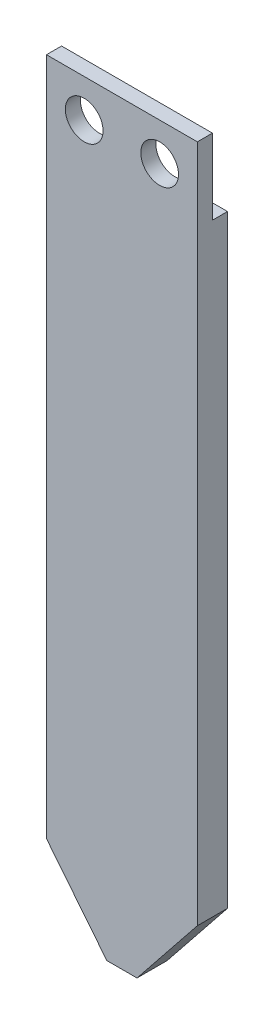
ISO-10303-21;
HEADER;
FILE_DESCRIPTION(('STEP AP214'),'2;1');
FILE_NAME('part.step','',(''),(''),'','','');
FILE_SCHEMA(('AUTOMOTIVE_DESIGN { 1 0 10303 214 1 1 1 1 }'));
ENDSEC;
DATA;
#1=APPLICATION_CONTEXT('core data for automotive mechanical design processes');
#2=APPLICATION_PROTOCOL_DEFINITION('international standard','automotive_design',2000,#1);
#3=PRODUCT_CONTEXT('',#1,'mechanical');
#4=PRODUCT('Part','Part','',(#3));
#5=PRODUCT_RELATED_PRODUCT_CATEGORY('part','',(#4));
#6=PRODUCT_DEFINITION_FORMATION('','',#4);
#7=PRODUCT_DEFINITION_CONTEXT('part definition',#1,'design');
#8=PRODUCT_DEFINITION('design','',#6,#7);
#9=PRODUCT_DEFINITION_SHAPE('','',#8);
#10=(LENGTH_UNIT() NAMED_UNIT(*) SI_UNIT(.MILLI.,.METRE.));
#11=(NAMED_UNIT(*) PLANE_ANGLE_UNIT() SI_UNIT($,.RADIAN.));
#12=(NAMED_UNIT(*) SI_UNIT($,.STERADIAN.) SOLID_ANGLE_UNIT());
#13=UNCERTAINTY_MEASURE_WITH_UNIT(LENGTH_MEASURE(1.E-05),#10,'distance_accuracy_value','');
#14=(GEOMETRIC_REPRESENTATION_CONTEXT(3) GLOBAL_UNCERTAINTY_ASSIGNED_CONTEXT((#13)) GLOBAL_UNIT_ASSIGNED_CONTEXT((#10,
#11,#12)) REPRESENTATION_CONTEXT('',''));
#15=CARTESIAN_POINT('',(0.,0.,0.));
#16=DIRECTION('',(0.,0.,1.));
#17=DIRECTION('',(1.,0.,0.));
#18=AXIS2_PLACEMENT_3D('',#15,#16,#17);
#19=CARTESIAN_POINT('',(0.,0.,4.));
#20=DIRECTION('',(1.,0.,0.));
#21=DIRECTION('',(0.,1.,0.));
#22=AXIS2_PLACEMENT_3D('',#19,#20,#21);
#23=PLANE('',#22);
#24=DIRECTION('',(0.,-1.,0.));
#25=VECTOR('',#24,1.);
#26=CARTESIAN_POINT('',(0.,0.,0.));
#27=LINE('',#26,#25);
#28=CARTESIAN_POINT('',(0.,-10.,0.));
#29=VERTEX_POINT('',#28);
#30=CARTESIAN_POINT('',(0.,-90.,0.));
#31=VERTEX_POINT('',#30);
#32=EDGE_CURVE('E124',#29,#31,#27,.T.);
#33=ORIENTED_EDGE('',*,*,#32,.T.);
#34=DIRECTION('',(0.,0.,1.));
#35=VECTOR('',#34,1.);
#36=CARTESIAN_POINT('',(0.,-90.,0.));
#37=LINE('',#36,#35);
#38=CARTESIAN_POINT('',(0.,-90.,4.));
#39=VERTEX_POINT('',#38);
#40=EDGE_CURVE('E61',#31,#39,#37,.T.);
#41=ORIENTED_EDGE('',*,*,#40,.T.);
#42=DIRECTION('',(0.,-1.,0.));
#43=VECTOR('',#42,1.);
#44=CARTESIAN_POINT('',(0.,0.,4.));
#45=LINE('',#44,#43);
#46=CARTESIAN_POINT('',(0.,0.,4.));
#47=VERTEX_POINT('',#46);
#48=EDGE_CURVE('E126',#47,#39,#45,.T.);
#49=ORIENTED_EDGE('',*,*,#48,.F.);
#50=DIRECTION('',(0.,0.,-1.));
#51=VECTOR('',#50,1.);
#52=CARTESIAN_POINT('',(0.,0.,4.));
#53=LINE('',#52,#51);
#54=CARTESIAN_POINT('',(0.,0.,2.));
#55=VERTEX_POINT('',#54);
#56=EDGE_CURVE('E46',#47,#55,#53,.T.);
#57=ORIENTED_EDGE('',*,*,#56,.T.);
#58=DIRECTION('',(0.,1.,0.));
#59=VECTOR('',#58,1.);
#60=CARTESIAN_POINT('',(0.,0.,2.));
#61=LINE('',#60,#59);
#62=CARTESIAN_POINT('',(0.,-10.,2.));
#63=VERTEX_POINT('',#62);
#64=EDGE_CURVE('E162',#63,#55,#61,.T.);
#65=ORIENTED_EDGE('',*,*,#64,.F.);
#66=DIRECTION('',(0.,0.,-1.));
#67=VECTOR('',#66,1.);
#68=CARTESIAN_POINT('',(0.,-10.,2.));
#69=LINE('',#68,#67);
#70=EDGE_CURVE('E157',#63,#29,#69,.T.);
#71=ORIENTED_EDGE('',*,*,#70,.T.);
#72=EDGE_LOOP('',(#33,#41,#49,#57,#65,#71));
#73=FACE_BOUND('',#72,.T.);
#74=ADVANCED_FACE('F38',(#73),#23,.F.);
#75=CARTESIAN_POINT('',(0.,-100.,4.));
#76=DIRECTION('',(0.,1.,0.));
#77=DIRECTION('',(0.,0.,1.));
#78=AXIS2_PLACEMENT_3D('',#75,#76,#77);
#79=PLANE('',#78);
#80=DIRECTION('',(1.,0.,0.));
#81=VECTOR('',#80,1.);
#82=CARTESIAN_POINT('',(0.,-100.,4.));
#83=LINE('',#82,#81);
#84=CARTESIAN_POINT('',(8.00000000000001,-100.,4.));
#85=VERTEX_POINT('',#84);
#86=CARTESIAN_POINT('',(12.,-100.,4.));
#87=VERTEX_POINT('',#86);
#88=EDGE_CURVE('E117',#85,#87,#83,.T.);
#89=ORIENTED_EDGE('',*,*,#88,.F.);
#90=DIRECTION('',(0.,0.,1.));
#91=VECTOR('',#90,1.);
#92=CARTESIAN_POINT('',(8.00000000000001,-100.,0.));
#93=LINE('',#92,#91);
#94=CARTESIAN_POINT('',(8.00000000000001,-100.,0.));
#95=VERTEX_POINT('',#94);
#96=EDGE_CURVE('E103',#95,#85,#93,.T.);
#97=ORIENTED_EDGE('',*,*,#96,.F.);
#98=DIRECTION('',(1.,0.,0.));
#99=VECTOR('',#98,1.);
#100=CARTESIAN_POINT('',(0.,-100.,0.));
#101=LINE('',#100,#99);
#102=CARTESIAN_POINT('',(12.,-100.,0.));
#103=VERTEX_POINT('',#102);
#104=EDGE_CURVE('E115',#95,#103,#101,.T.);
#105=ORIENTED_EDGE('',*,*,#104,.T.);
#106=DIRECTION('',(0.,0.,1.));
#107=VECTOR('',#106,1.);
#108=CARTESIAN_POINT('',(12.,-100.,0.));
#109=LINE('',#108,#107);
#110=EDGE_CURVE('E53',#103,#87,#109,.T.);
#111=ORIENTED_EDGE('',*,*,#110,.T.);
#112=EDGE_LOOP('',(#89,#97,#105,#111));
#113=FACE_BOUND('',#112,.T.);
#114=ADVANCED_FACE('F114',(#113),#79,.F.);
#115=CARTESIAN_POINT('',(20.,0.,4.));
#116=DIRECTION('',(-1.,0.,0.));
#117=DIRECTION('',(0.,-1.,0.));
#118=AXIS2_PLACEMENT_3D('',#115,#116,#117);
#119=PLANE('',#118);
#120=DIRECTION('',(0.,1.,0.));
#121=VECTOR('',#120,1.);
#122=CARTESIAN_POINT('',(20.,0.,4.));
#123=LINE('',#122,#121);
#124=CARTESIAN_POINT('',(20.,-90.,4.));
#125=VERTEX_POINT('',#124);
#126=CARTESIAN_POINT('',(20.,0.,4.));
#127=VERTEX_POINT('',#126);
#128=EDGE_CURVE('E138',#125,#127,#123,.T.);
#129=ORIENTED_EDGE('',*,*,#128,.F.);
#130=DIRECTION('',(0.,0.,1.));
#131=VECTOR('',#130,1.);
#132=CARTESIAN_POINT('',(20.,-90.,0.));
#133=LINE('',#132,#131);
#134=CARTESIAN_POINT('',(20.,-90.,0.));
#135=VERTEX_POINT('',#134);
#136=EDGE_CURVE('E170',#135,#125,#133,.T.);
#137=ORIENTED_EDGE('',*,*,#136,.F.);
#138=DIRECTION('',(0.,1.,0.));
#139=VECTOR('',#138,1.);
#140=CARTESIAN_POINT('',(20.,0.,0.));
#141=LINE('',#140,#139);
#142=CARTESIAN_POINT('',(20.,-9.99999999999999,0.));
#143=VERTEX_POINT('',#142);
#144=EDGE_CURVE('E123',#135,#143,#141,.T.);
#145=ORIENTED_EDGE('',*,*,#144,.T.);
#146=DIRECTION('',(0.,0.,-1.));
#147=VECTOR('',#146,1.);
#148=CARTESIAN_POINT('',(20.,-9.99999999999999,2.));
#149=LINE('',#148,#147);
#150=CARTESIAN_POINT('',(20.,-9.99999999999999,2.));
#151=VERTEX_POINT('',#150);
#152=EDGE_CURVE('E154',#151,#143,#149,.T.);
#153=ORIENTED_EDGE('',*,*,#152,.F.);
#154=DIRECTION('',(0.,-1.,0.));
#155=VECTOR('',#154,1.);
#156=CARTESIAN_POINT('',(20.,0.,2.));
#157=LINE('',#156,#155);
#158=CARTESIAN_POINT('',(20.,0.,2.));
#159=VERTEX_POINT('',#158);
#160=EDGE_CURVE('E165',#159,#151,#157,.T.);
#161=ORIENTED_EDGE('',*,*,#160,.F.);
#162=DIRECTION('',(0.,0.,-1.));
#163=VECTOR('',#162,1.);
#164=CARTESIAN_POINT('',(20.,0.,4.));
#165=LINE('',#164,#163);
#166=EDGE_CURVE('E11',#127,#159,#165,.T.);
#167=ORIENTED_EDGE('',*,*,#166,.F.);
#168=EDGE_LOOP('',(#129,#137,#145,#153,#161,#167));
#169=FACE_BOUND('',#168,.T.);
#170=ADVANCED_FACE('F203',(#169),#119,.F.);
#171=CARTESIAN_POINT('',(0.,0.,4.));
#172=DIRECTION('',(0.,-1.,0.));
#173=DIRECTION('',(0.,0.,-1.));
#174=AXIS2_PLACEMENT_3D('',#171,#172,#173);
#175=PLANE('',#174);
#176=ORIENTED_EDGE('',*,*,#166,.T.);
#177=DIRECTION('',(1.,0.,0.));
#178=VECTOR('',#177,1.);
#179=CARTESIAN_POINT('',(0.,0.,2.));
#180=LINE('',#179,#178);
#181=EDGE_CURVE('E167',#55,#159,#180,.T.);
#182=ORIENTED_EDGE('',*,*,#181,.F.);
#183=ORIENTED_EDGE('',*,*,#56,.F.);
#184=DIRECTION('',(-1.,0.,0.));
#185=VECTOR('',#184,1.);
#186=CARTESIAN_POINT('',(0.,0.,4.));
#187=LINE('',#186,#185);
#188=EDGE_CURVE('E133',#127,#47,#187,.T.);
#189=ORIENTED_EDGE('',*,*,#188,.F.);
#190=EDGE_LOOP('',(#176,#182,#183,#189));
#191=FACE_BOUND('',#190,.T.);
#192=ADVANCED_FACE('F180',(#191),#175,.F.);
#193=CARTESIAN_POINT('',(0.,0.,4.));
#194=DIRECTION('',(0.,0.,1.));
#195=DIRECTION('',(1.,0.,0.));
#196=AXIS2_PLACEMENT_3D('',#193,#194,#195);
#197=PLANE('',#196);
#198=DIRECTION('',(-0.624695047554425,0.78086880944303,0.));
#199=VECTOR('',#198,1.);
#200=CARTESIAN_POINT('',(8.00000000000001,-100.,4.));
#201=LINE('',#200,#199);
#202=EDGE_CURVE('E109',#85,#39,#201,.T.);
#203=ORIENTED_EDGE('',*,*,#202,.F.);
#204=ORIENTED_EDGE('',*,*,#88,.T.);
#205=DIRECTION('',(-0.624695047554424,-0.78086880944303,0.));
#206=VECTOR('',#205,1.);
#207=CARTESIAN_POINT('',(12.,-100.,4.));
#208=LINE('',#207,#206);
#209=EDGE_CURVE('E173',#125,#87,#208,.T.);
#210=ORIENTED_EDGE('',*,*,#209,.F.);
#211=ORIENTED_EDGE('',*,*,#128,.T.);
#212=ORIENTED_EDGE('',*,*,#188,.T.);
#213=ORIENTED_EDGE('',*,*,#48,.T.);
#214=EDGE_LOOP('',(#203,#204,#210,#211,#212,#213));
#215=FACE_BOUND('',#214,.T.);
#216=CARTESIAN_POINT('',(5.,-5.,4.));
#217=DIRECTION('',(0.,0.,1.));
#218=DIRECTION('',(1.,0.,0.));
#219=AXIS2_PLACEMENT_3D('',#216,#217,#218);
#220=CIRCLE('',#219,2.5);
#221=CARTESIAN_POINT('',(7.5,-5.,4.));
#222=VERTEX_POINT('',#221);
#223=EDGE_CURVE('E128',#222,#222,#220,.T.);
#224=ORIENTED_EDGE('',*,*,#223,.F.);
#225=EDGE_LOOP('',(#224));
#226=FACE_BOUND('',#225,.T.);
#227=CARTESIAN_POINT('',(15.,-5.,4.));
#228=DIRECTION('',(0.,0.,1.));
#229=DIRECTION('',(1.,0.,0.));
#230=AXIS2_PLACEMENT_3D('',#227,#228,#229);
#231=CIRCLE('',#230,2.5);
#232=CARTESIAN_POINT('',(17.5,-5.,4.));
#233=VERTEX_POINT('',#232);
#234=EDGE_CURVE('E146',#233,#233,#231,.T.);
#235=ORIENTED_EDGE('',*,*,#234,.F.);
#236=EDGE_LOOP('',(#235));
#237=FACE_BOUND('',#236,.T.);
#238=ADVANCED_FACE('F177',(#215,#226,#237),#197,.T.);
#239=CARTESIAN_POINT('',(0.,0.,0.));
#240=DIRECTION('',(0.,0.,1.));
#241=DIRECTION('',(1.,0.,0.));
#242=AXIS2_PLACEMENT_3D('',#239,#240,#241);
#243=PLANE('',#242);
#244=ORIENTED_EDGE('',*,*,#104,.F.);
#245=DIRECTION('',(-0.624695047554425,0.78086880944303,0.));
#246=VECTOR('',#245,1.);
#247=CARTESIAN_POINT('',(8.00000000000001,-100.,0.));
#248=LINE('',#247,#246);
#249=EDGE_CURVE('E100',#95,#31,#248,.T.);
#250=ORIENTED_EDGE('',*,*,#249,.T.);
#251=ORIENTED_EDGE('',*,*,#32,.F.);
#252=DIRECTION('',(-1.,0.,0.));
#253=VECTOR('',#252,1.);
#254=CARTESIAN_POINT('',(0.,-10.,0.));
#255=LINE('',#254,#253);
#256=EDGE_CURVE('E118',#143,#29,#255,.T.);
#257=ORIENTED_EDGE('',*,*,#256,.F.);
#258=ORIENTED_EDGE('',*,*,#144,.F.);
#259=DIRECTION('',(-0.624695047554424,-0.78086880944303,0.));
#260=VECTOR('',#259,1.);
#261=CARTESIAN_POINT('',(12.,-100.,0.));
#262=LINE('',#261,#260);
#263=EDGE_CURVE('E122',#135,#103,#262,.T.);
#264=ORIENTED_EDGE('',*,*,#263,.T.);
#265=EDGE_LOOP('',(#244,#250,#251,#257,#258,#264));
#266=FACE_BOUND('',#265,.T.);
#267=ADVANCED_FACE('F120',(#266),#243,.F.);
#268=CARTESIAN_POINT('',(15.,-5.,0.));
#269=DIRECTION('',(0.,0.,1.));
#270=DIRECTION('',(1.,0.,0.));
#271=AXIS2_PLACEMENT_3D('',#268,#269,#270);
#272=CYLINDRICAL_SURFACE('',#271,2.5);
#273=CARTESIAN_POINT('',(15.,-5.,2.));
#274=DIRECTION('',(0.,0.,1.));
#275=DIRECTION('',(1.,0.,0.));
#276=AXIS2_PLACEMENT_3D('',#273,#274,#275);
#277=CIRCLE('',#276,2.5);
#278=CARTESIAN_POINT('',(17.5,-5.,2.));
#279=VERTEX_POINT('',#278);
#280=EDGE_CURVE('E149',#279,#279,#277,.F.);
#281=ORIENTED_EDGE('',*,*,#280,.T.);
#282=EDGE_LOOP('',(#281));
#283=FACE_BOUND('',#282,.T.);
#284=ORIENTED_EDGE('',*,*,#234,.T.);
#285=EDGE_LOOP('',(#284));
#286=FACE_BOUND('',#285,.T.);
#287=ADVANCED_FACE('F186',(#283,#286),#272,.F.);
#288=CARTESIAN_POINT('',(5.,-5.,0.));
#289=DIRECTION('',(0.,0.,1.));
#290=DIRECTION('',(1.,0.,0.));
#291=AXIS2_PLACEMENT_3D('',#288,#289,#290);
#292=CYLINDRICAL_SURFACE('',#291,2.5);
#293=CARTESIAN_POINT('',(5.,-5.,2.));
#294=DIRECTION('',(0.,0.,1.));
#295=DIRECTION('',(1.,0.,0.));
#296=AXIS2_PLACEMENT_3D('',#293,#294,#295);
#297=CIRCLE('',#296,2.5);
#298=CARTESIAN_POINT('',(7.5,-5.,2.));
#299=VERTEX_POINT('',#298);
#300=EDGE_CURVE('E41',#299,#299,#297,.F.);
#301=ORIENTED_EDGE('',*,*,#300,.T.);
#302=EDGE_LOOP('',(#301));
#303=FACE_BOUND('',#302,.T.);
#304=ORIENTED_EDGE('',*,*,#223,.T.);
#305=EDGE_LOOP('',(#304));
#306=FACE_BOUND('',#305,.T.);
#307=ADVANCED_FACE('F188',(#303,#306),#292,.F.);
#308=CARTESIAN_POINT('',(0.,0.,2.));
#309=DIRECTION('',(0.,0.,1.));
#310=DIRECTION('',(1.,0.,0.));
#311=AXIS2_PLACEMENT_3D('',#308,#309,#310);
#312=PLANE('',#311);
#313=ORIENTED_EDGE('',*,*,#300,.F.);
#314=EDGE_LOOP('',(#313));
#315=FACE_BOUND('',#314,.T.);
#316=ORIENTED_EDGE('',*,*,#64,.T.);
#317=ORIENTED_EDGE('',*,*,#181,.T.);
#318=ORIENTED_EDGE('',*,*,#160,.T.);
#319=DIRECTION('',(-1.,0.,0.));
#320=VECTOR('',#319,1.);
#321=CARTESIAN_POINT('',(0.,-10.,2.));
#322=LINE('',#321,#320);
#323=EDGE_CURVE('E158',#151,#63,#322,.T.);
#324=ORIENTED_EDGE('',*,*,#323,.T.);
#325=EDGE_LOOP('',(#316,#317,#318,#324));
#326=FACE_BOUND('',#325,.T.);
#327=ORIENTED_EDGE('',*,*,#280,.F.);
#328=EDGE_LOOP('',(#327));
#329=FACE_BOUND('',#328,.T.);
#330=ADVANCED_FACE('F195',(#315,#326,#329),#312,.F.);
#331=CARTESIAN_POINT('',(0.,-10.,2.));
#332=DIRECTION('',(0.,-1.,0.));
#333=DIRECTION('',(1.,0.,0.));
#334=AXIS2_PLACEMENT_3D('',#331,#332,#333);
#335=PLANE('',#334);
#336=ORIENTED_EDGE('',*,*,#256,.T.);
#337=ORIENTED_EDGE('',*,*,#70,.F.);
#338=ORIENTED_EDGE('',*,*,#323,.F.);
#339=ORIENTED_EDGE('',*,*,#152,.T.);
#340=EDGE_LOOP('',(#336,#337,#338,#339));
#341=FACE_BOUND('',#340,.T.);
#342=ADVANCED_FACE('F224',(#341),#335,.F.);
#343=CARTESIAN_POINT('',(12.,-100.,0.));
#344=DIRECTION('',(-0.78086880944303,0.624695047554425,0.));
#345=DIRECTION('',(-0.624695047554425,-0.78086880944303,0.));
#346=AXIS2_PLACEMENT_3D('',#343,#344,#345);
#347=PLANE('',#346);
#348=ORIENTED_EDGE('',*,*,#209,.T.);
#349=ORIENTED_EDGE('',*,*,#110,.F.);
#350=ORIENTED_EDGE('',*,*,#263,.F.);
#351=ORIENTED_EDGE('',*,*,#136,.T.);
#352=EDGE_LOOP('',(#348,#349,#350,#351));
#353=FACE_BOUND('',#352,.T.);
#354=ADVANCED_FACE('F227',(#353),#347,.F.);
#355=CARTESIAN_POINT('',(8.00000000000001,-100.,0.));
#356=DIRECTION('',(0.78086880944303,0.624695047554425,0.));
#357=DIRECTION('',(-0.624695047554425,0.78086880944303,0.));
#358=AXIS2_PLACEMENT_3D('',#355,#356,#357);
#359=PLANE('',#358);
#360=ORIENTED_EDGE('',*,*,#202,.T.);
#361=ORIENTED_EDGE('',*,*,#40,.F.);
#362=ORIENTED_EDGE('',*,*,#249,.F.);
#363=ORIENTED_EDGE('',*,*,#96,.T.);
#364=EDGE_LOOP('',(#360,#361,#362,#363));
#365=FACE_BOUND('',#364,.T.);
#366=ADVANCED_FACE('F102',(#365),#359,.F.);
#367=CLOSED_SHELL('',(#74,#114,#170,#192,#238,#267,#287,#307,#330,#342,#354,#366));
#368=MANIFOLD_SOLID_BREP('B2',#367);
#369=ADVANCED_BREP_SHAPE_REPRESENTATION('',(#18,#368),#14);
#370=SHAPE_DEFINITION_REPRESENTATION(#9,#369);
ENDSEC;
END-ISO-10303-21;
